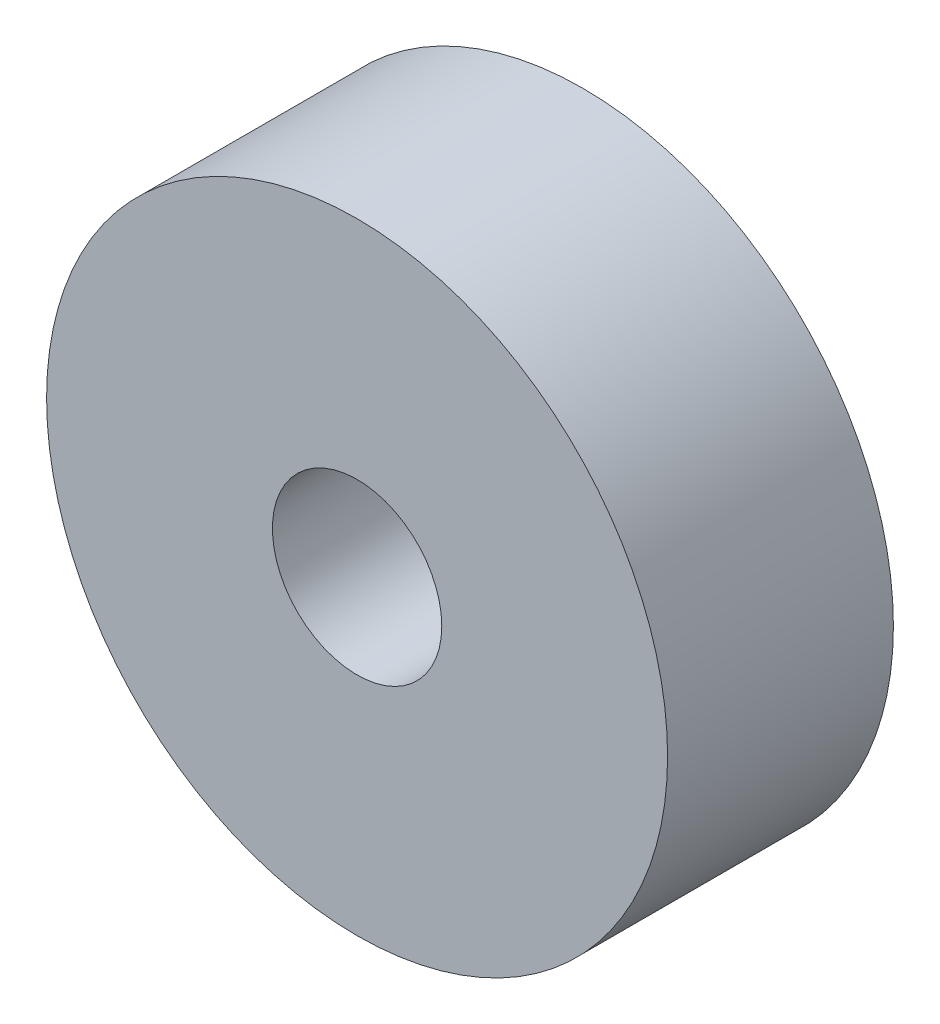
ISO-10303-21;
HEADER;
FILE_DESCRIPTION(('STEP AP214'),'2;1');
FILE_NAME('part.step','',(''),(''),'','','');
FILE_SCHEMA(('AUTOMOTIVE_DESIGN { 1 0 10303 214 1 1 1 1 }'));
ENDSEC;
DATA;
#1=APPLICATION_CONTEXT('core data for automotive mechanical design processes');
#2=APPLICATION_PROTOCOL_DEFINITION('international standard','automotive_design',2000,#1);
#3=PRODUCT_CONTEXT('',#1,'mechanical');
#4=PRODUCT('Part','Part','',(#3));
#5=PRODUCT_RELATED_PRODUCT_CATEGORY('part','',(#4));
#6=PRODUCT_DEFINITION_FORMATION('','',#4);
#7=PRODUCT_DEFINITION_CONTEXT('part definition',#1,'design');
#8=PRODUCT_DEFINITION('design','',#6,#7);
#9=PRODUCT_DEFINITION_SHAPE('','',#8);
#10=(LENGTH_UNIT() NAMED_UNIT(*) SI_UNIT(.MILLI.,.METRE.));
#11=(NAMED_UNIT(*) PLANE_ANGLE_UNIT() SI_UNIT($,.RADIAN.));
#12=(NAMED_UNIT(*) SI_UNIT($,.STERADIAN.) SOLID_ANGLE_UNIT());
#13=UNCERTAINTY_MEASURE_WITH_UNIT(LENGTH_MEASURE(1.E-05),#10,'distance_accuracy_value','');
#14=(GEOMETRIC_REPRESENTATION_CONTEXT(3) GLOBAL_UNCERTAINTY_ASSIGNED_CONTEXT((#13)) GLOBAL_UNIT_ASSIGNED_CONTEXT((#10,
#11,#12)) REPRESENTATION_CONTEXT('',''));
#15=CARTESIAN_POINT('',(0.,0.,0.));
#16=DIRECTION('',(0.,0.,1.));
#17=DIRECTION('',(1.,0.,0.));
#18=AXIS2_PLACEMENT_3D('',#15,#16,#17);
#19=CARTESIAN_POINT('',(0.,0.,6.35));
#20=DIRECTION('',(0.,0.,1.));
#21=DIRECTION('',(1.,0.,0.));
#22=AXIS2_PLACEMENT_3D('',#19,#20,#21);
#23=PLANE('',#22);
#24=CARTESIAN_POINT('',(0.,0.,6.35));
#25=DIRECTION('',(0.,0.,1.));
#26=DIRECTION('',(1.,0.,0.));
#27=AXIS2_PLACEMENT_3D('',#24,#25,#26);
#28=CIRCLE('',#27,8.73125);
#29=CARTESIAN_POINT('',(8.73125,0.,6.35));
#30=VERTEX_POINT('',#29);
#31=EDGE_CURVE('E10',#30,#30,#28,.T.);
#32=ORIENTED_EDGE('',*,*,#31,.T.);
#33=EDGE_LOOP('',(#32));
#34=FACE_BOUND('',#33,.T.);
#35=CARTESIAN_POINT('',(0.,0.,6.35));
#36=DIRECTION('',(0.,0.,1.));
#37=DIRECTION('',(1.,0.,0.));
#38=AXIS2_PLACEMENT_3D('',#35,#36,#37);
#39=CIRCLE('',#38,2.38125);
#40=CARTESIAN_POINT('',(2.38125,0.,6.35));
#41=VERTEX_POINT('',#40);
#42=EDGE_CURVE('E50',#41,#41,#39,.T.);
#43=ORIENTED_EDGE('',*,*,#42,.F.);
#44=EDGE_LOOP('',(#43));
#45=FACE_BOUND('',#44,.T.);
#46=ADVANCED_FACE('F37',(#34,#45),#23,.T.);
#47=CARTESIAN_POINT('',(0.,0.,0.));
#48=DIRECTION('',(0.,0.,1.));
#49=DIRECTION('',(1.,0.,0.));
#50=AXIS2_PLACEMENT_3D('',#47,#48,#49);
#51=PLANE('',#50);
#52=CARTESIAN_POINT('',(0.,0.,0.));
#53=DIRECTION('',(0.,0.,1.));
#54=DIRECTION('',(1.,0.,0.));
#55=AXIS2_PLACEMENT_3D('',#52,#53,#54);
#56=CIRCLE('',#55,8.73125);
#57=CARTESIAN_POINT('',(8.73125,0.,0.));
#58=VERTEX_POINT('',#57);
#59=EDGE_CURVE('E41',#58,#58,#56,.T.);
#60=ORIENTED_EDGE('',*,*,#59,.F.);
#61=EDGE_LOOP('',(#60));
#62=FACE_BOUND('',#61,.T.);
#63=CARTESIAN_POINT('',(0.,0.,0.));
#64=DIRECTION('',(0.,0.,1.));
#65=DIRECTION('',(1.,0.,0.));
#66=AXIS2_PLACEMENT_3D('',#63,#64,#65);
#67=CIRCLE('',#66,2.38125);
#68=CARTESIAN_POINT('',(2.38125,0.,0.));
#69=VERTEX_POINT('',#68);
#70=EDGE_CURVE('E52',#69,#69,#67,.T.);
#71=ORIENTED_EDGE('',*,*,#70,.T.);
#72=EDGE_LOOP('',(#71));
#73=FACE_BOUND('',#72,.T.);
#74=ADVANCED_FACE('F64',(#62,#73),#51,.F.);
#75=CARTESIAN_POINT('',(0.,0.,6.35));
#76=DIRECTION('',(0.,0.,-1.));
#77=DIRECTION('',(-1.,0.,0.));
#78=AXIS2_PLACEMENT_3D('',#75,#76,#77);
#79=CYLINDRICAL_SURFACE('',#78,8.73125);
#80=ORIENTED_EDGE('',*,*,#31,.F.);
#81=EDGE_LOOP('',(#80));
#82=FACE_BOUND('',#81,.T.);
#83=ORIENTED_EDGE('',*,*,#59,.T.);
#84=EDGE_LOOP('',(#83));
#85=FACE_BOUND('',#84,.T.);
#86=ADVANCED_FACE('F39',(#82,#85),#79,.T.);
#87=CARTESIAN_POINT('',(0.,0.,6.35));
#88=DIRECTION('',(0.,0.,-1.));
#89=DIRECTION('',(-1.,0.,0.));
#90=AXIS2_PLACEMENT_3D('',#87,#88,#89);
#91=CYLINDRICAL_SURFACE('',#90,2.38125);
#92=ORIENTED_EDGE('',*,*,#42,.T.);
#93=EDGE_LOOP('',(#92));
#94=FACE_BOUND('',#93,.T.);
#95=ORIENTED_EDGE('',*,*,#70,.F.);
#96=EDGE_LOOP('',(#95));
#97=FACE_BOUND('',#96,.T.);
#98=ADVANCED_FACE('F60',(#94,#97),#91,.F.);
#99=CLOSED_SHELL('',(#46,#74,#86,#98));
#100=MANIFOLD_SOLID_BREP('B2',#99);
#101=ADVANCED_BREP_SHAPE_REPRESENTATION('',(#18,#100),#14);
#102=SHAPE_DEFINITION_REPRESENTATION(#9,#101);
ENDSEC;
END-ISO-10303-21;
